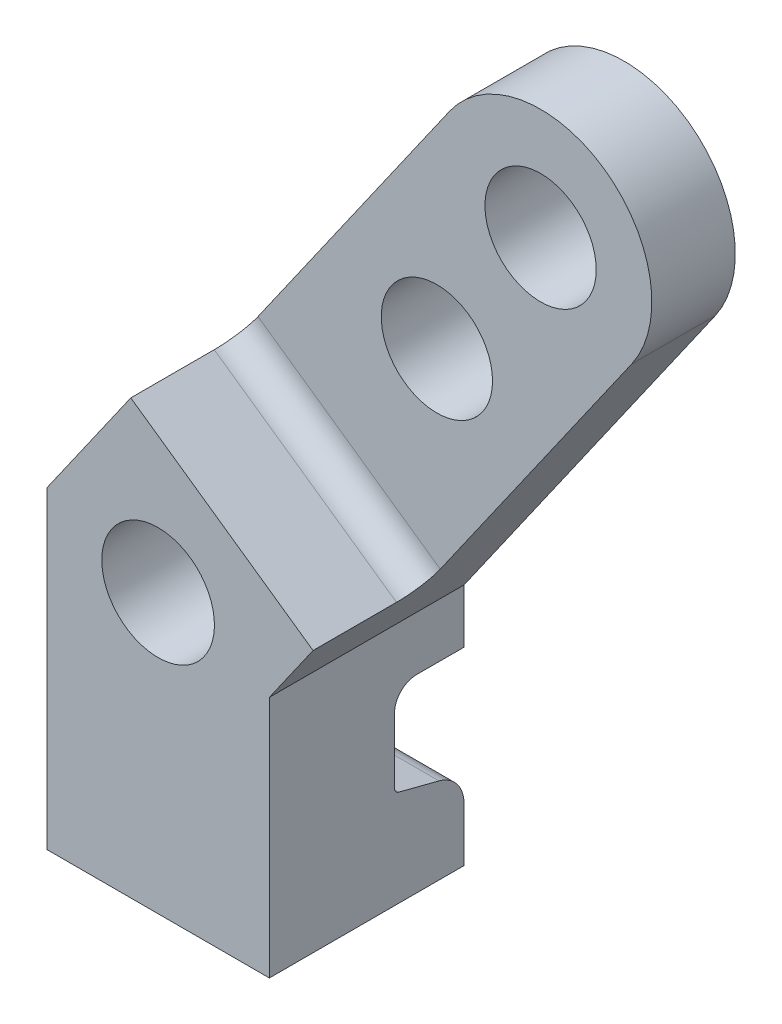
ISO-10303-21;
HEADER;
FILE_DESCRIPTION(('STEP AP214'),'2;1');
FILE_NAME('part.step','',(''),(''),'','','');
FILE_SCHEMA(('AUTOMOTIVE_DESIGN { 1 0 10303 214 1 1 1 1 }'));
ENDSEC;
DATA;
#1=APPLICATION_CONTEXT('core data for automotive mechanical design processes');
#2=APPLICATION_PROTOCOL_DEFINITION('international standard','automotive_design',2000,#1);
#3=PRODUCT_CONTEXT('',#1,'mechanical');
#4=PRODUCT('Part','Part','',(#3));
#5=PRODUCT_RELATED_PRODUCT_CATEGORY('part','',(#4));
#6=PRODUCT_DEFINITION_FORMATION('','',#4);
#7=PRODUCT_DEFINITION_CONTEXT('part definition',#1,'design');
#8=PRODUCT_DEFINITION('design','',#6,#7);
#9=PRODUCT_DEFINITION_SHAPE('','',#8);
#10=(LENGTH_UNIT() NAMED_UNIT(*) SI_UNIT(.MILLI.,.METRE.));
#11=(NAMED_UNIT(*) PLANE_ANGLE_UNIT() SI_UNIT($,.RADIAN.));
#12=(NAMED_UNIT(*) SI_UNIT($,.STERADIAN.) SOLID_ANGLE_UNIT());
#13=UNCERTAINTY_MEASURE_WITH_UNIT(LENGTH_MEASURE(1.E-05),#10,'distance_accuracy_value','');
#14=(GEOMETRIC_REPRESENTATION_CONTEXT(3) GLOBAL_UNCERTAINTY_ASSIGNED_CONTEXT((#13)) GLOBAL_UNIT_ASSIGNED_CONTEXT((#10,
#11,#12)) REPRESENTATION_CONTEXT('',''));
#15=CARTESIAN_POINT('',(0.,0.,0.));
#16=DIRECTION('',(0.,0.,1.));
#17=DIRECTION('',(1.,0.,0.));
#18=AXIS2_PLACEMENT_3D('',#15,#16,#17);
#19=CARTESIAN_POINT('',(64.7419124081177,162.198904983171,70.));
#20=DIRECTION('',(0.819152044288993,-0.573576436351044,0.));
#21=DIRECTION('',(0.573576436351044,0.819152044288993,0.));
#22=AXIS2_PLACEMENT_3D('',#19,#20,#21);
#23=PLANE('',#22);
#24=DIRECTION('',(0.,0.,-1.));
#25=VECTOR('',#24,1.);
#26=CARTESIAN_POINT('',(-40.,12.6119515551592,70.));
#27=LINE('',#26,#25);
#28=CARTESIAN_POINT('',(-40.,12.6119515551592,0.));
#29=VERTEX_POINT('',#28);
#30=CARTESIAN_POINT('',(-40.,12.6119515551592,-70.));
#31=VERTEX_POINT('',#30);
#32=EDGE_CURVE('E41',#29,#31,#27,.T.);
#33=ORIENTED_EDGE('',*,*,#32,.F.);
#34=DIRECTION('',(0.573576436351044,0.819152044288993,0.));
#35=VECTOR('',#34,1.);
#36=CARTESIAN_POINT('',(64.7419124081177,162.198904983171,0.));
#37=LINE('',#36,#35);
#38=CARTESIAN_POINT('',(-9.823024317518,55.7091392256015,0.));
#39=VERTEX_POINT('',#38);
#40=EDGE_CURVE('E150',#29,#39,#37,.T.);
#41=ORIENTED_EDGE('',*,*,#40,.T.);
#42=DIRECTION('',(0.,0.,-1.));
#43=VECTOR('',#42,1.);
#44=CARTESIAN_POINT('',(-9.823024317518,55.7091392256015,40.));
#45=LINE('',#44,#43);
#46=CARTESIAN_POINT('',(-9.823024317518,55.7091392256015,-30.));
#47=VERTEX_POINT('',#46);
#48=EDGE_CURVE('E172',#39,#47,#45,.T.);
#49=ORIENTED_EDGE('',*,*,#48,.T.);
#50=CARTESIAN_POINT('',(-4.08725995400754,63.9006596684914,-30.));
#51=DIRECTION('',(-0.819152044288993,0.573576436351044,0.));
#52=DIRECTION('',(0.573576436351044,0.819152044288993,0.));
#53=AXIS2_PLACEMENT_3D('',#50,#51,#52);
#54=CIRCLE('',#53,10.);
#55=CARTESIAN_POINT('',(-4.08725995400756,63.9006596684914,-40.));
#56=VERTEX_POINT('',#55);
#57=EDGE_CURVE('E176',#56,#47,#54,.T.);
#58=ORIENTED_EDGE('',*,*,#57,.F.);
#59=DIRECTION('',(-0.573576436351044,-0.819152044288993,0.));
#60=VECTOR('',#59,1.);
#61=CARTESIAN_POINT('',(104.892262952691,219.5395480834,-40.));
#62=LINE('',#61,#60);
#63=CARTESIAN_POINT('',(64.7419124081177,162.198904983171,-40.));
#64=VERTEX_POINT('',#63);
#65=EDGE_CURVE('E266',#64,#56,#62,.T.);
#66=ORIENTED_EDGE('',*,*,#65,.F.);
#67=DIRECTION('',(0.,0.,1.));
#68=VECTOR('',#67,1.);
#69=CARTESIAN_POINT('',(64.7419124081177,162.198904983171,-70.));
#70=LINE('',#69,#68);
#71=CARTESIAN_POINT('',(64.7419124081177,162.198904983171,-70.));
#72=VERTEX_POINT('',#71);
#73=EDGE_CURVE('E223',#72,#64,#70,.T.);
#74=ORIENTED_EDGE('',*,*,#73,.F.);
#75=DIRECTION('',(-0.573576436351044,-0.819152044288993,0.));
#76=VECTOR('',#75,1.);
#77=CARTESIAN_POINT('',(64.7419124081177,162.198904983171,-70.));
#78=LINE('',#77,#76);
#79=EDGE_CURVE('E246',#72,#31,#78,.T.);
#80=ORIENTED_EDGE('',*,*,#79,.T.);
#81=EDGE_LOOP('',(#33,#41,#49,#58,#66,#74,#80));
#82=FACE_BOUND('',#81,.T.);
#83=ADVANCED_FACE('F34',(#82),#23,.F.);
#84=CARTESIAN_POINT('',(130.274075951237,116.312790075087,70.));
#85=DIRECTION('',(-0.819152044288993,0.573576436351044,0.));
#86=DIRECTION('',(-0.573576436351044,-0.819152044288993,0.));
#87=AXIS2_PLACEMENT_3D('',#84,#85,#86);
#88=PLANE('',#87);
#89=DIRECTION('',(0.,0.,-1.));
#90=VECTOR('',#89,1.);
#91=CARTESIAN_POINT('',(55.7091392256015,9.82302431751797,40.));
#92=LINE('',#91,#90);
#93=CARTESIAN_POINT('',(55.7091392256015,9.82302431751797,0.));
#94=VERTEX_POINT('',#93);
#95=CARTESIAN_POINT('',(55.7091392256015,9.82302431751797,-30.));
#96=VERTEX_POINT('',#95);
#97=EDGE_CURVE('E174',#94,#96,#92,.T.);
#98=ORIENTED_EDGE('',*,*,#97,.F.);
#99=DIRECTION('',(-0.573576436351044,-0.819152044288993,0.));
#100=VECTOR('',#99,1.);
#101=CARTESIAN_POINT('',(130.274075951237,116.312790075087,0.));
#102=LINE('',#101,#100);
#103=CARTESIAN_POINT('',(40.,-12.6119515551593,0.));
#104=VERTEX_POINT('',#103);
#105=EDGE_CURVE('E47',#94,#104,#102,.T.);
#106=ORIENTED_EDGE('',*,*,#105,.T.);
#107=DIRECTION('',(0.,0.,-1.));
#108=VECTOR('',#107,1.);
#109=CARTESIAN_POINT('',(40.,-12.6119515551593,70.));
#110=LINE('',#109,#108);
#111=CARTESIAN_POINT('',(40.,-12.6119515551593,-70.));
#112=VERTEX_POINT('',#111);
#113=EDGE_CURVE('E168',#104,#112,#110,.T.);
#114=ORIENTED_EDGE('',*,*,#113,.T.);
#115=DIRECTION('',(0.573576436351044,0.819152044288993,0.));
#116=VECTOR('',#115,1.);
#117=CARTESIAN_POINT('',(130.274075951237,116.312790075087,-70.));
#118=LINE('',#117,#116);
#119=CARTESIAN_POINT('',(130.274075951237,116.312790075087,-70.));
#120=VERTEX_POINT('',#119);
#121=EDGE_CURVE('E234',#112,#120,#118,.T.);
#122=ORIENTED_EDGE('',*,*,#121,.T.);
#123=DIRECTION('',(0.,0.,1.));
#124=VECTOR('',#123,1.);
#125=CARTESIAN_POINT('',(130.274075951237,116.312790075087,-70.));
#126=LINE('',#125,#124);
#127=CARTESIAN_POINT('',(130.274075951237,116.312790075087,-40.));
#128=VERTEX_POINT('',#127);
#129=EDGE_CURVE('E231',#120,#128,#126,.T.);
#130=ORIENTED_EDGE('',*,*,#129,.T.);
#131=DIRECTION('',(0.573576436351044,0.819152044288993,0.));
#132=VECTOR('',#131,1.);
#133=CARTESIAN_POINT('',(55.7091392256015,9.82302431751797,-40.));
#134=LINE('',#133,#132);
#135=CARTESIAN_POINT('',(61.4449035891119,18.0145447604079,-40.));
#136=VERTEX_POINT('',#135);
#137=EDGE_CURVE('E228',#136,#128,#134,.T.);
#138=ORIENTED_EDGE('',*,*,#137,.F.);
#139=CARTESIAN_POINT('',(61.444903589112,18.0145447604079,-30.));
#140=DIRECTION('',(0.819152044288993,-0.573576436351044,0.));
#141=DIRECTION('',(-0.573576436351044,-0.819152044288993,0.));
#142=AXIS2_PLACEMENT_3D('',#139,#140,#141);
#143=CIRCLE('',#142,10.);
#144=EDGE_CURVE('E178',#96,#136,#143,.T.);
#145=ORIENTED_EDGE('',*,*,#144,.F.);
#146=EDGE_LOOP('',(#98,#106,#114,#122,#130,#138,#145));
#147=FACE_BOUND('',#146,.T.);
#148=ADVANCED_FACE('F290',(#147),#88,.F.);
#149=CARTESIAN_POINT('',(-40.,12.6119515551592,70.));
#150=DIRECTION('',(1.,0.,0.));
#151=DIRECTION('',(0.,1.,0.));
#152=AXIS2_PLACEMENT_3D('',#149,#150,#151);
#153=PLANE('',#152);
#154=DIRECTION('',(0.,0.,-1.));
#155=VECTOR('',#154,1.);
#156=CARTESIAN_POINT('',(-40.,-100.,70.));
#157=LINE('',#156,#155);
#158=CARTESIAN_POINT('',(-40.,-100.,0.));
#159=VERTEX_POINT('',#158);
#160=CARTESIAN_POINT('',(-40.,-100.,-70.));
#161=VERTEX_POINT('',#160);
#162=EDGE_CURVE('E159',#159,#161,#157,.T.);
#163=ORIENTED_EDGE('',*,*,#162,.F.);
#164=DIRECTION('',(0.,-1.,0.));
#165=VECTOR('',#164,1.);
#166=CARTESIAN_POINT('',(-40.,200.,0.));
#167=LINE('',#166,#165);
#168=EDGE_CURVE('E144',#29,#159,#167,.T.);
#169=ORIENTED_EDGE('',*,*,#168,.F.);
#170=ORIENTED_EDGE('',*,*,#32,.T.);
#171=DIRECTION('',(0.,-1.,0.));
#172=VECTOR('',#171,1.);
#173=CARTESIAN_POINT('',(-40.,12.6119515551592,-70.));
#174=LINE('',#173,#172);
#175=CARTESIAN_POINT('',(-40.,-32.,-70.));
#176=VERTEX_POINT('',#175);
#177=EDGE_CURVE('E243',#31,#176,#174,.T.);
#178=ORIENTED_EDGE('',*,*,#177,.T.);
#179=DIRECTION('',(0.,0.,1.));
#180=VECTOR('',#179,1.);
#181=CARTESIAN_POINT('',(-40.,-32.,-70.));
#182=LINE('',#181,#180);
#183=CARTESIAN_POINT('',(-40.,-32.,-53.));
#184=VERTEX_POINT('',#183);
#185=EDGE_CURVE('E278',#176,#184,#182,.T.);
#186=ORIENTED_EDGE('',*,*,#185,.T.);
#187=CARTESIAN_POINT('',(-40.,-40.,-53.));
#188=DIRECTION('',(-1.,0.,0.));
#189=DIRECTION('',(0.,1.,0.));
#190=AXIS2_PLACEMENT_3D('',#187,#188,#189);
#191=CIRCLE('',#190,8.);
#192=CARTESIAN_POINT('',(-40.,-40.,-45.));
#193=VERTEX_POINT('',#192);
#194=EDGE_CURVE('E187',#193,#184,#191,.T.);
#195=ORIENTED_EDGE('',*,*,#194,.F.);
#196=DIRECTION('',(0.,-1.,0.));
#197=VECTOR('',#196,1.);
#198=CARTESIAN_POINT('',(-40.,-32.,-45.));
#199=LINE('',#198,#197);
#200=CARTESIAN_POINT('',(-40.,-63.450806661517,-45.));
#201=VERTEX_POINT('',#200);
#202=EDGE_CURVE('E275',#193,#201,#199,.T.);
#203=ORIENTED_EDGE('',*,*,#202,.T.);
#204=CARTESIAN_POINT('',(-40.,-63.450806661517,-47.));
#205=DIRECTION('',(-1.,0.,0.));
#206=DIRECTION('',(0.,1.,0.));
#207=AXIS2_PLACEMENT_3D('',#204,#205,#206);
#208=CIRCLE('',#207,2.);
#209=CARTESIAN_POINT('',(-40.,-65.3872983346207,-46.5));
#210=VERTEX_POINT('',#209);
#211=EDGE_CURVE('E197',#210,#201,#208,.T.);
#212=ORIENTED_EDGE('',*,*,#211,.F.);
#213=DIRECTION('',(0.,-0.250000000000001,-0.968245836551854));
#214=VECTOR('',#213,1.);
#215=CARTESIAN_POINT('',(-40.,-65.,-45.));
#216=LINE('',#215,#214);
#217=CARTESIAN_POINT('',(-40.,-69.1311822359546,-61.));
#218=VERTEX_POINT('',#217);
#219=EDGE_CURVE('E272',#210,#218,#216,.T.);
#220=ORIENTED_EDGE('',*,*,#219,.T.);
#221=CARTESIAN_POINT('',(-40.,-80.7501322745768,-58.));
#222=DIRECTION('',(-1.,0.,0.));
#223=DIRECTION('',(0.,1.,0.));
#224=AXIS2_PLACEMENT_3D('',#221,#222,#223);
#225=CIRCLE('',#224,12.);
#226=CARTESIAN_POINT('',(-40.,-80.7501322745768,-70.));
#227=VERTEX_POINT('',#226);
#228=EDGE_CURVE('E208',#227,#218,#225,.F.);
#229=ORIENTED_EDGE('',*,*,#228,.F.);
#230=EDGE_CURVE('E165',#227,#161,#174,.T.);
#231=ORIENTED_EDGE('',*,*,#230,.T.);
#232=EDGE_LOOP('',(#163,#169,#170,#178,#186,#195,#203,#212,#220,#229,#231));
#233=FACE_BOUND('',#232,.T.);
#234=ADVANCED_FACE('F163',(#233),#153,.F.);
#235=CARTESIAN_POINT('',(-40.,-100.,70.));
#236=DIRECTION('',(0.,1.,0.));
#237=DIRECTION('',(0.,0.,1.));
#238=AXIS2_PLACEMENT_3D('',#235,#236,#237);
#239=PLANE('',#238);
#240=DIRECTION('',(0.,0.,-1.));
#241=VECTOR('',#240,1.);
#242=CARTESIAN_POINT('',(40.,-100.,70.));
#243=LINE('',#242,#241);
#244=CARTESIAN_POINT('',(40.,-100.,0.));
#245=VERTEX_POINT('',#244);
#246=CARTESIAN_POINT('',(40.,-100.,-70.));
#247=VERTEX_POINT('',#246);
#248=EDGE_CURVE('E161',#245,#247,#243,.T.);
#249=ORIENTED_EDGE('',*,*,#248,.F.);
#250=DIRECTION('',(-1.,0.,0.));
#251=VECTOR('',#250,1.);
#252=CARTESIAN_POINT('',(137.507994179678,-100.,0.));
#253=LINE('',#252,#251);
#254=EDGE_CURVE('E147',#245,#159,#253,.T.);
#255=ORIENTED_EDGE('',*,*,#254,.T.);
#256=ORIENTED_EDGE('',*,*,#162,.T.);
#257=DIRECTION('',(1.,0.,0.));
#258=VECTOR('',#257,1.);
#259=CARTESIAN_POINT('',(-40.,-100.,-70.));
#260=LINE('',#259,#258);
#261=EDGE_CURVE('E241',#161,#247,#260,.T.);
#262=ORIENTED_EDGE('',*,*,#261,.T.);
#263=EDGE_LOOP('',(#249,#255,#256,#262));
#264=FACE_BOUND('',#263,.T.);
#265=ADVANCED_FACE('F157',(#264),#239,.F.);
#266=CARTESIAN_POINT('',(40.,-100.,70.));
#267=DIRECTION('',(-1.,0.,0.));
#268=DIRECTION('',(0.,-1.,0.));
#269=AXIS2_PLACEMENT_3D('',#266,#267,#268);
#270=PLANE('',#269);
#271=ORIENTED_EDGE('',*,*,#113,.F.);
#272=DIRECTION('',(0.,-1.,0.));
#273=VECTOR('',#272,1.);
#274=CARTESIAN_POINT('',(40.,-100.,0.));
#275=LINE('',#274,#273);
#276=EDGE_CURVE('E284',#104,#245,#275,.T.);
#277=ORIENTED_EDGE('',*,*,#276,.T.);
#278=ORIENTED_EDGE('',*,*,#248,.T.);
#279=DIRECTION('',(0.,1.,0.));
#280=VECTOR('',#279,1.);
#281=CARTESIAN_POINT('',(40.,-100.,-70.));
#282=LINE('',#281,#280);
#283=CARTESIAN_POINT('',(40.,-80.7501322745768,-70.));
#284=VERTEX_POINT('',#283);
#285=EDGE_CURVE('E237',#247,#284,#282,.T.);
#286=ORIENTED_EDGE('',*,*,#285,.T.);
#287=CARTESIAN_POINT('',(40.,-80.7501322745768,-58.));
#288=DIRECTION('',(1.,0.,0.));
#289=DIRECTION('',(0.,-1.,0.));
#290=AXIS2_PLACEMENT_3D('',#287,#288,#289);
#291=CIRCLE('',#290,12.);
#292=CARTESIAN_POINT('',(40.,-69.1311822359546,-61.));
#293=VERTEX_POINT('',#292);
#294=EDGE_CURVE('E204',#293,#284,#291,.F.);
#295=ORIENTED_EDGE('',*,*,#294,.F.);
#296=DIRECTION('',(0.,-0.250000000000001,-0.968245836551854));
#297=VECTOR('',#296,1.);
#298=CARTESIAN_POINT('',(40.,-73.2390364784491,-76.9096510698288));
#299=LINE('',#298,#297);
#300=CARTESIAN_POINT('',(40.,-65.3872983346207,-46.5));
#301=VERTEX_POINT('',#300);
#302=EDGE_CURVE('E214',#301,#293,#299,.T.);
#303=ORIENTED_EDGE('',*,*,#302,.F.);
#304=CARTESIAN_POINT('',(40.,-63.450806661517,-47.));
#305=DIRECTION('',(1.,0.,0.));
#306=DIRECTION('',(0.,-1.,0.));
#307=AXIS2_PLACEMENT_3D('',#304,#305,#306);
#308=CIRCLE('',#307,2.);
#309=CARTESIAN_POINT('',(40.,-63.450806661517,-45.));
#310=VERTEX_POINT('',#309);
#311=EDGE_CURVE('E194',#310,#301,#308,.T.);
#312=ORIENTED_EDGE('',*,*,#311,.F.);
#313=DIRECTION('',(0.,-1.,0.));
#314=VECTOR('',#313,1.);
#315=CARTESIAN_POINT('',(40.,-100.,-45.));
#316=LINE('',#315,#314);
#317=CARTESIAN_POINT('',(40.,-40.,-45.));
#318=VERTEX_POINT('',#317);
#319=EDGE_CURVE('E217',#318,#310,#316,.T.);
#320=ORIENTED_EDGE('',*,*,#319,.F.);
#321=CARTESIAN_POINT('',(40.,-40.,-53.));
#322=DIRECTION('',(1.,0.,0.));
#323=DIRECTION('',(0.,-1.,0.));
#324=AXIS2_PLACEMENT_3D('',#321,#322,#323);
#325=CIRCLE('',#324,8.);
#326=CARTESIAN_POINT('',(40.,-32.,-53.));
#327=VERTEX_POINT('',#326);
#328=EDGE_CURVE('E184',#327,#318,#325,.T.);
#329=ORIENTED_EDGE('',*,*,#328,.F.);
#330=DIRECTION('',(0.,0.,1.));
#331=VECTOR('',#330,1.);
#332=CARTESIAN_POINT('',(40.,-32.,-70.));
#333=LINE('',#332,#331);
#334=CARTESIAN_POINT('',(40.,-32.,-70.));
#335=VERTEX_POINT('',#334);
#336=EDGE_CURVE('E220',#335,#327,#333,.T.);
#337=ORIENTED_EDGE('',*,*,#336,.F.);
#338=EDGE_CURVE('E240',#335,#112,#282,.T.);
#339=ORIENTED_EDGE('',*,*,#338,.T.);
#340=EDGE_LOOP('',(#271,#277,#278,#286,#295,#303,#312,#320,#329,#337,#339));
#341=FACE_BOUND('',#340,.T.);
#342=ADVANCED_FACE('F294',(#341),#270,.F.);
#343=CARTESIAN_POINT('',(0.,0.,70.));
#344=DIRECTION('',(0.,0.,-1.));
#345=DIRECTION('',(-1.,0.,0.));
#346=AXIS2_PLACEMENT_3D('',#343,#344,#345);
#347=CYLINDRICAL_SURFACE('',#346,20.25);
#348=CARTESIAN_POINT('',(0.,0.,0.));
#349=DIRECTION('',(0.,0.,-1.));
#350=DIRECTION('',(0.,1.,0.));
#351=AXIS2_PLACEMENT_3D('',#348,#349,#350);
#352=CIRCLE('',#351,20.25);
#353=CARTESIAN_POINT('',(0.,20.25,0.));
#354=VERTEX_POINT('',#353);
#355=EDGE_CURVE('E281',#354,#354,#352,.T.);
#356=ORIENTED_EDGE('',*,*,#355,.F.);
#357=EDGE_LOOP('',(#356));
#358=FACE_BOUND('',#357,.T.);
#359=CARTESIAN_POINT('',(0.,0.,-70.));
#360=DIRECTION('',(0.,0.,1.));
#361=DIRECTION('',(1.,0.,0.));
#362=AXIS2_PLACEMENT_3D('',#359,#360,#361);
#363=CIRCLE('',#362,20.25);
#364=CARTESIAN_POINT('',(20.25,0.,-70.));
#365=VERTEX_POINT('',#364);
#366=EDGE_CURVE('E251',#365,#365,#363,.T.);
#367=ORIENTED_EDGE('',*,*,#366,.F.);
#368=EDGE_LOOP('',(#367));
#369=FACE_BOUND('',#368,.T.);
#370=ADVANCED_FACE('F349',(#358,#369),#347,.F.);
#371=CARTESIAN_POINT('',(-9.823024317518,55.7091392256015,40.));
#372=DIRECTION('',(0.573576436351044,0.819152044288994,0.));
#373=DIRECTION('',(-0.819152044288994,0.573576436351044,0.));
#374=AXIS2_PLACEMENT_3D('',#371,#372,#373);
#375=PLANE('',#374);
#376=DIRECTION('',(-0.819152044288994,0.573576436351044,0.));
#377=VECTOR('',#376,1.);
#378=CARTESIAN_POINT('',(-9.823024317518,55.7091392256015,0.));
#379=LINE('',#378,#377);
#380=EDGE_CURVE('E11',#94,#39,#379,.T.);
#381=ORIENTED_EDGE('',*,*,#380,.F.);
#382=ORIENTED_EDGE('',*,*,#97,.T.);
#383=DIRECTION('',(0.819152044288994,-0.573576436351044,0.));
#384=VECTOR('',#383,1.);
#385=CARTESIAN_POINT('',(-9.823024317518,55.7091392256015,-30.));
#386=LINE('',#385,#384);
#387=EDGE_CURVE('E181',#47,#96,#386,.T.);
#388=ORIENTED_EDGE('',*,*,#387,.F.);
#389=ORIENTED_EDGE('',*,*,#48,.F.);
#390=EDGE_LOOP('',(#381,#382,#388,#389));
#391=FACE_BOUND('',#390,.T.);
#392=ADVANCED_FACE('F316',(#391),#375,.T.);
#393=CARTESIAN_POINT('',(97.5079941796775,139.255847529129,-70.));
#394=DIRECTION('',(0.,0.,1.));
#395=DIRECTION('',(-1.,0.,0.));
#396=AXIS2_PLACEMENT_3D('',#393,#394,#395);
#397=PLANE('',#396);
#398=ORIENTED_EDGE('',*,*,#285,.F.);
#399=ORIENTED_EDGE('',*,*,#261,.F.);
#400=ORIENTED_EDGE('',*,*,#230,.F.);
#401=DIRECTION('',(-1.,0.,0.));
#402=VECTOR('',#401,1.);
#403=CARTESIAN_POINT('',(97.5079941796775,-80.7501322745768,-70.));
#404=LINE('',#403,#402);
#405=EDGE_CURVE('E211',#284,#227,#404,.T.);
#406=ORIENTED_EDGE('',*,*,#405,.F.);
#407=EDGE_LOOP('',(#398,#399,#400,#406));
#408=FACE_BOUND('',#407,.T.);
#409=ADVANCED_FACE('F341',(#408),#397,.F.);
#410=CARTESIAN_POINT('',(97.5079941796775,139.255847529129,-70.));
#411=DIRECTION('',(0.,0.,1.));
#412=DIRECTION('',(1.,0.,0.));
#413=AXIS2_PLACEMENT_3D('',#410,#411,#412);
#414=CIRCLE('',#413,20.);
#415=CARTESIAN_POINT('',(117.507994179677,139.255847529129,-70.));
#416=VERTEX_POINT('',#415);
#417=EDGE_CURVE('E254',#416,#416,#414,.T.);
#418=ORIENTED_EDGE('',*,*,#417,.T.);
#419=EDGE_LOOP('',(#418));
#420=FACE_BOUND('',#419,.T.);
#421=ORIENTED_EDGE('',*,*,#177,.F.);
#422=ORIENTED_EDGE('',*,*,#79,.F.);
#423=CARTESIAN_POINT('',(97.5079941796775,139.255847529129,-70.));
#424=DIRECTION('',(0.,0.,1.));
#425=DIRECTION('',(-1.,0.,0.));
#426=AXIS2_PLACEMENT_3D('',#423,#424,#425);
#427=CIRCLE('',#426,40.);
#428=EDGE_CURVE('E249',#120,#72,#427,.T.);
#429=ORIENTED_EDGE('',*,*,#428,.F.);
#430=ORIENTED_EDGE('',*,*,#121,.F.);
#431=ORIENTED_EDGE('',*,*,#338,.F.);
#432=DIRECTION('',(-1.,0.,0.));
#433=VECTOR('',#432,1.);
#434=CARTESIAN_POINT('',(137.507994179677,-32.,-70.));
#435=LINE('',#434,#433);
#436=EDGE_CURVE('E269',#335,#176,#435,.T.);
#437=ORIENTED_EDGE('',*,*,#436,.T.);
#438=EDGE_LOOP('',(#421,#422,#429,#430,#431,#437));
#439=FACE_BOUND('',#438,.T.);
#440=ORIENTED_EDGE('',*,*,#366,.T.);
#441=EDGE_LOOP('',(#440));
#442=FACE_BOUND('',#441,.T.);
#443=CARTESIAN_POINT('',(60.2255258168596,86.0109646503443,-70.));
#444=DIRECTION('',(0.,0.,1.));
#445=DIRECTION('',(1.,0.,0.));
#446=AXIS2_PLACEMENT_3D('',#443,#444,#445);
#447=CIRCLE('',#446,20.);
#448=CARTESIAN_POINT('',(80.2255258168596,86.0109646503443,-70.));
#449=VERTEX_POINT('',#448);
#450=EDGE_CURVE('E257',#449,#449,#447,.T.);
#451=ORIENTED_EDGE('',*,*,#450,.T.);
#452=EDGE_LOOP('',(#451));
#453=FACE_BOUND('',#452,.T.);
#454=ADVANCED_FACE('F301',(#420,#439,#442,#453),#397,.F.);
#455=CARTESIAN_POINT('',(97.5079941796775,139.255847529129,-70.));
#456=DIRECTION('',(0.,0.,1.));
#457=DIRECTION('',(-1.,0.,0.));
#458=AXIS2_PLACEMENT_3D('',#455,#456,#457);
#459=CYLINDRICAL_SURFACE('',#458,40.);
#460=ORIENTED_EDGE('',*,*,#129,.F.);
#461=ORIENTED_EDGE('',*,*,#428,.T.);
#462=ORIENTED_EDGE('',*,*,#73,.T.);
#463=CARTESIAN_POINT('',(97.5079941796775,139.255847529129,-40.));
#464=DIRECTION('',(0.,0.,1.));
#465=DIRECTION('',(1.,0.,0.));
#466=AXIS2_PLACEMENT_3D('',#463,#464,#465);
#467=CIRCLE('',#466,40.);
#468=EDGE_CURVE('E260',#128,#64,#467,.T.);
#469=ORIENTED_EDGE('',*,*,#468,.F.);
#470=EDGE_LOOP('',(#460,#461,#462,#469));
#471=FACE_BOUND('',#470,.T.);
#472=ADVANCED_FACE('F307',(#471),#459,.T.);
#473=CARTESIAN_POINT('',(97.5079941796775,139.255847529129,-70.));
#474=DIRECTION('',(0.,0.,1.));
#475=DIRECTION('',(-1.,0.,0.));
#476=AXIS2_PLACEMENT_3D('',#473,#474,#475);
#477=CYLINDRICAL_SURFACE('',#476,20.);
#478=CARTESIAN_POINT('',(97.5079941796775,139.255847529129,-40.));
#479=DIRECTION('',(0.,0.,1.));
#480=DIRECTION('',(1.,0.,0.));
#481=AXIS2_PLACEMENT_3D('',#478,#479,#480);
#482=CIRCLE('',#481,20.);
#483=CARTESIAN_POINT('',(117.507994179677,139.255847529129,-40.));
#484=VERTEX_POINT('',#483);
#485=EDGE_CURVE('E227',#484,#484,#482,.T.);
#486=ORIENTED_EDGE('',*,*,#485,.T.);
#487=EDGE_LOOP('',(#486));
#488=FACE_BOUND('',#487,.T.);
#489=ORIENTED_EDGE('',*,*,#417,.F.);
#490=EDGE_LOOP('',(#489));
#491=FACE_BOUND('',#490,.T.);
#492=ADVANCED_FACE('F453',(#488,#491),#477,.F.);
#493=CARTESIAN_POINT('',(60.2255258168596,86.0109646503443,-70.));
#494=DIRECTION('',(0.,0.,1.));
#495=DIRECTION('',(-1.,0.,0.));
#496=AXIS2_PLACEMENT_3D('',#493,#494,#495);
#497=CYLINDRICAL_SURFACE('',#496,20.);
#498=CARTESIAN_POINT('',(60.2255258168596,86.0109646503443,-40.));
#499=DIRECTION('',(0.,0.,1.));
#500=DIRECTION('',(1.,0.,0.));
#501=AXIS2_PLACEMENT_3D('',#498,#499,#500);
#502=CIRCLE('',#501,20.);
#503=CARTESIAN_POINT('',(80.2255258168596,86.0109646503443,-40.));
#504=VERTEX_POINT('',#503);
#505=EDGE_CURVE('E224',#504,#504,#502,.T.);
#506=ORIENTED_EDGE('',*,*,#505,.T.);
#507=EDGE_LOOP('',(#506));
#508=FACE_BOUND('',#507,.T.);
#509=ORIENTED_EDGE('',*,*,#450,.F.);
#510=EDGE_LOOP('',(#509));
#511=FACE_BOUND('',#510,.T.);
#512=ADVANCED_FACE('F445',(#508,#511),#497,.F.);
#513=CARTESIAN_POINT('',(0.,0.,-40.));
#514=DIRECTION('',(0.,0.,-1.));
#515=DIRECTION('',(1.,0.,0.));
#516=AXIS2_PLACEMENT_3D('',#513,#514,#515);
#517=PLANE('',#516);
#518=ORIENTED_EDGE('',*,*,#505,.F.);
#519=EDGE_LOOP('',(#518));
#520=FACE_BOUND('',#519,.T.);
#521=ORIENTED_EDGE('',*,*,#485,.F.);
#522=EDGE_LOOP('',(#521));
#523=FACE_BOUND('',#522,.T.);
#524=ORIENTED_EDGE('',*,*,#137,.T.);
#525=ORIENTED_EDGE('',*,*,#468,.T.);
#526=ORIENTED_EDGE('',*,*,#65,.T.);
#527=DIRECTION('',(0.819152044288994,-0.573576436351044,0.));
#528=VECTOR('',#527,1.);
#529=CARTESIAN_POINT('',(28.6788218175522,40.9576022144497,-40.));
#530=LINE('',#529,#528);
#531=EDGE_CURVE('E55',#136,#56,#530,.F.);
#532=ORIENTED_EDGE('',*,*,#531,.F.);
#533=EDGE_LOOP('',(#524,#525,#526,#532));
#534=FACE_BOUND('',#533,.T.);
#535=ADVANCED_FACE('F311',(#520,#523,#534),#517,.F.);
#536=CARTESIAN_POINT('',(137.507994179677,-65.,-45.));
#537=DIRECTION('',(0.,-0.968245836551854,0.250000000000001));
#538=DIRECTION('',(0.,0.250000000000001,0.968245836551854));
#539=AXIS2_PLACEMENT_3D('',#536,#537,#538);
#540=PLANE('',#539);
#541=ORIENTED_EDGE('',*,*,#302,.T.);
#542=DIRECTION('',(-1.,0.,0.));
#543=VECTOR('',#542,1.);
#544=CARTESIAN_POINT('',(137.507994179677,-69.1311822359546,-61.));
#545=LINE('',#544,#543);
#546=EDGE_CURVE('E206',#218,#293,#545,.F.);
#547=ORIENTED_EDGE('',*,*,#546,.F.);
#548=ORIENTED_EDGE('',*,*,#219,.F.);
#549=DIRECTION('',(-1.,0.,0.));
#550=VECTOR('',#549,1.);
#551=CARTESIAN_POINT('',(-39.9999999999999,-65.3872983346207,-46.5));
#552=LINE('',#551,#550);
#553=EDGE_CURVE('E202',#301,#210,#552,.T.);
#554=ORIENTED_EDGE('',*,*,#553,.F.);
#555=EDGE_LOOP('',(#541,#547,#548,#554));
#556=FACE_BOUND('',#555,.T.);
#557=ADVANCED_FACE('F333',(#556),#540,.F.);
#558=CARTESIAN_POINT('',(137.507994179677,-32.,-45.));
#559=DIRECTION('',(0.,0.,1.));
#560=DIRECTION('',(0.,1.,0.));
#561=AXIS2_PLACEMENT_3D('',#558,#559,#560);
#562=PLANE('',#561);
#563=ORIENTED_EDGE('',*,*,#319,.T.);
#564=DIRECTION('',(-1.,0.,0.));
#565=VECTOR('',#564,1.);
#566=CARTESIAN_POINT('',(40.,-63.450806661517,-45.));
#567=LINE('',#566,#565);
#568=EDGE_CURVE('E200',#201,#310,#567,.F.);
#569=ORIENTED_EDGE('',*,*,#568,.F.);
#570=ORIENTED_EDGE('',*,*,#202,.F.);
#571=DIRECTION('',(-1.,0.,0.));
#572=VECTOR('',#571,1.);
#573=CARTESIAN_POINT('',(-40.,-40.,-45.));
#574=LINE('',#573,#572);
#575=EDGE_CURVE('E192',#318,#193,#574,.T.);
#576=ORIENTED_EDGE('',*,*,#575,.F.);
#577=EDGE_LOOP('',(#563,#569,#570,#576));
#578=FACE_BOUND('',#577,.T.);
#579=ADVANCED_FACE('F327',(#578),#562,.F.);
#580=CARTESIAN_POINT('',(137.507994179677,-32.,-70.));
#581=DIRECTION('',(0.,1.,0.));
#582=DIRECTION('',(0.,0.,-1.));
#583=AXIS2_PLACEMENT_3D('',#580,#581,#582);
#584=PLANE('',#583);
#585=ORIENTED_EDGE('',*,*,#185,.F.);
#586=ORIENTED_EDGE('',*,*,#436,.F.);
#587=ORIENTED_EDGE('',*,*,#336,.T.);
#588=DIRECTION('',(-1.,0.,0.));
#589=VECTOR('',#588,1.);
#590=CARTESIAN_POINT('',(40.,-32.,-53.));
#591=LINE('',#590,#589);
#592=EDGE_CURVE('E190',#184,#327,#591,.F.);
#593=ORIENTED_EDGE('',*,*,#592,.F.);
#594=EDGE_LOOP('',(#585,#586,#587,#593));
#595=FACE_BOUND('',#594,.T.);
#596=ADVANCED_FACE('F319',(#595),#584,.F.);
#597=CARTESIAN_POINT('',(97.5079941796775,-80.7501322745768,-58.));
#598=DIRECTION('',(-1.,0.,0.));
#599=DIRECTION('',(0.,-1.,0.));
#600=AXIS2_PLACEMENT_3D('',#597,#598,#599);
#601=CYLINDRICAL_SURFACE('',#600,12.);
#602=ORIENTED_EDGE('',*,*,#294,.T.);
#603=ORIENTED_EDGE('',*,*,#405,.T.);
#604=ORIENTED_EDGE('',*,*,#228,.T.);
#605=ORIENTED_EDGE('',*,*,#546,.T.);
#606=EDGE_LOOP('',(#602,#603,#604,#605));
#607=FACE_BOUND('',#606,.T.);
#608=ADVANCED_FACE('F337',(#607),#601,.T.);
#609=CARTESIAN_POINT('',(137.507994179677,-63.450806661517,-47.));
#610=DIRECTION('',(1.,0.,0.));
#611=DIRECTION('',(0.,1.,0.));
#612=AXIS2_PLACEMENT_3D('',#609,#610,#611);
#613=CYLINDRICAL_SURFACE('',#612,2.);
#614=ORIENTED_EDGE('',*,*,#311,.T.);
#615=ORIENTED_EDGE('',*,*,#553,.T.);
#616=ORIENTED_EDGE('',*,*,#211,.T.);
#617=ORIENTED_EDGE('',*,*,#568,.T.);
#618=EDGE_LOOP('',(#614,#615,#616,#617));
#619=FACE_BOUND('',#618,.T.);
#620=ADVANCED_FACE('F330',(#619),#613,.F.);
#621=CARTESIAN_POINT('',(137.507994179677,-40.,-53.));
#622=DIRECTION('',(1.,0.,0.));
#623=DIRECTION('',(0.,1.,0.));
#624=AXIS2_PLACEMENT_3D('',#621,#622,#623);
#625=CYLINDRICAL_SURFACE('',#624,8.);
#626=ORIENTED_EDGE('',*,*,#328,.T.);
#627=ORIENTED_EDGE('',*,*,#575,.T.);
#628=ORIENTED_EDGE('',*,*,#194,.T.);
#629=ORIENTED_EDGE('',*,*,#592,.T.);
#630=EDGE_LOOP('',(#626,#627,#628,#629));
#631=FACE_BOUND('',#630,.T.);
#632=ADVANCED_FACE('F324',(#631),#625,.F.);
#633=CARTESIAN_POINT('',(-4.08725995400756,63.9006596684914,-30.));
#634=DIRECTION('',(0.819152044288994,-0.573576436351044,0.));
#635=DIRECTION('',(0.573576436351044,0.819152044288994,0.));
#636=AXIS2_PLACEMENT_3D('',#633,#634,#635);
#637=CYLINDRICAL_SURFACE('',#636,10.);
#638=ORIENTED_EDGE('',*,*,#57,.T.);
#639=ORIENTED_EDGE('',*,*,#387,.T.);
#640=ORIENTED_EDGE('',*,*,#144,.T.);
#641=ORIENTED_EDGE('',*,*,#531,.T.);
#642=EDGE_LOOP('',(#638,#639,#640,#641));
#643=FACE_BOUND('',#642,.T.);
#644=ADVANCED_FACE('F312',(#643),#637,.F.);
#645=CARTESIAN_POINT('',(137.507994179677,200.,0.));
#646=DIRECTION('',(0.,0.,-1.));
#647=DIRECTION('',(0.,1.,0.));
#648=AXIS2_PLACEMENT_3D('',#645,#646,#647);
#649=PLANE('',#648);
#650=ORIENTED_EDGE('',*,*,#355,.T.);
#651=EDGE_LOOP('',(#650));
#652=FACE_BOUND('',#651,.T.);
#653=ORIENTED_EDGE('',*,*,#105,.F.);
#654=ORIENTED_EDGE('',*,*,#380,.T.);
#655=ORIENTED_EDGE('',*,*,#40,.F.);
#656=ORIENTED_EDGE('',*,*,#168,.T.);
#657=ORIENTED_EDGE('',*,*,#254,.F.);
#658=ORIENTED_EDGE('',*,*,#276,.F.);
#659=EDGE_LOOP('',(#653,#654,#655,#656,#657,#658));
#660=FACE_BOUND('',#659,.T.);
#661=ADVANCED_FACE('F146',(#652,#660),#649,.F.);
#662=CLOSED_SHELL('',(#83,#148,#234,#265,#342,#370,#392,#409,#454,#472,#492,#512,#535,#557,#579,
#596,#608,#620,#632,#644,#661));
#663=MANIFOLD_SOLID_BREP('B2',#662);
#664=ADVANCED_BREP_SHAPE_REPRESENTATION('',(#18,#663),#14);
#665=SHAPE_DEFINITION_REPRESENTATION(#9,#664);
ENDSEC;
END-ISO-10303-21;
